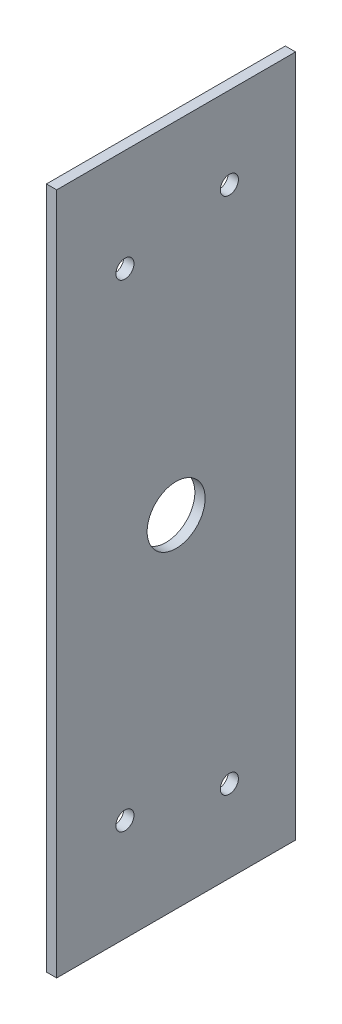
ISO-10303-21;
HEADER;
FILE_DESCRIPTION(('STEP AP214'),'2;1');
FILE_NAME('part.step','',(''),(''),'','','');
FILE_SCHEMA(('AUTOMOTIVE_DESIGN { 1 0 10303 214 1 1 1 1 }'));
ENDSEC;
DATA;
#1=APPLICATION_CONTEXT('core data for automotive mechanical design processes');
#2=APPLICATION_PROTOCOL_DEFINITION('international standard','automotive_design',2000,#1);
#3=PRODUCT_CONTEXT('',#1,'mechanical');
#4=PRODUCT('Part','Part','',(#3));
#5=PRODUCT_RELATED_PRODUCT_CATEGORY('part','',(#4));
#6=PRODUCT_DEFINITION_FORMATION('','',#4);
#7=PRODUCT_DEFINITION_CONTEXT('part definition',#1,'design');
#8=PRODUCT_DEFINITION('design','',#6,#7);
#9=PRODUCT_DEFINITION_SHAPE('','',#8);
#10=(LENGTH_UNIT() NAMED_UNIT(*) SI_UNIT(.MILLI.,.METRE.));
#11=(NAMED_UNIT(*) PLANE_ANGLE_UNIT() SI_UNIT($,.RADIAN.));
#12=(NAMED_UNIT(*) SI_UNIT($,.STERADIAN.) SOLID_ANGLE_UNIT());
#13=UNCERTAINTY_MEASURE_WITH_UNIT(LENGTH_MEASURE(1.E-05),#10,'distance_accuracy_value','');
#14=(GEOMETRIC_REPRESENTATION_CONTEXT(3) GLOBAL_UNCERTAINTY_ASSIGNED_CONTEXT((#13)) GLOBAL_UNIT_ASSIGNED_CONTEXT((#10,
#11,#12)) REPRESENTATION_CONTEXT('',''));
#15=CARTESIAN_POINT('',(0.,0.,0.));
#16=DIRECTION('',(0.,0.,1.));
#17=DIRECTION('',(1.,0.,0.));
#18=AXIS2_PLACEMENT_3D('',#15,#16,#17);
#19=CARTESIAN_POINT('',(3.,0.,0.));
#20=DIRECTION('',(1.,0.,0.));
#21=DIRECTION('',(0.,0.,-1.));
#22=AXIS2_PLACEMENT_3D('',#19,#20,#21);
#23=PLANE('',#22);
#24=CARTESIAN_POINT('',(3.,-70.,15.));
#25=DIRECTION('',(1.,0.,0.));
#26=DIRECTION('',(0.,0.,-1.));
#27=AXIS2_PLACEMENT_3D('',#24,#25,#26);
#28=CIRCLE('',#27,2.65);
#29=CARTESIAN_POINT('',(3.,-70.,12.35));
#30=VERTEX_POINT('',#29);
#31=EDGE_CURVE('E140',#30,#30,#28,.T.);
#32=ORIENTED_EDGE('',*,*,#31,.F.);
#33=EDGE_LOOP('',(#32));
#34=FACE_BOUND('',#33,.T.);
#35=CARTESIAN_POINT('',(3.,0.,0.));
#36=DIRECTION('',(1.,0.,0.));
#37=DIRECTION('',(0.,0.,-1.));
#38=AXIS2_PLACEMENT_3D('',#35,#36,#37);
#39=CIRCLE('',#38,8.5);
#40=CARTESIAN_POINT('',(3.,0.,-8.5));
#41=VERTEX_POINT('',#40);
#42=EDGE_CURVE('E121',#41,#41,#39,.T.);
#43=ORIENTED_EDGE('',*,*,#42,.F.);
#44=EDGE_LOOP('',(#43));
#45=FACE_BOUND('',#44,.T.);
#46=DIRECTION('',(0.,0.,-1.));
#47=VECTOR('',#46,1.);
#48=CARTESIAN_POINT('',(3.,-100.,35.));
#49=LINE('',#48,#47);
#50=CARTESIAN_POINT('',(3.,-100.,35.));
#51=VERTEX_POINT('',#50);
#52=CARTESIAN_POINT('',(3.,-100.,-35.));
#53=VERTEX_POINT('',#52);
#54=EDGE_CURVE('E92',#51,#53,#49,.T.);
#55=ORIENTED_EDGE('',*,*,#54,.T.);
#56=DIRECTION('',(0.,1.,0.));
#57=VECTOR('',#56,1.);
#58=CARTESIAN_POINT('',(3.,-100.,-35.));
#59=LINE('',#58,#57);
#60=CARTESIAN_POINT('',(3.,100.,-35.));
#61=VERTEX_POINT('',#60);
#62=EDGE_CURVE('E89',#53,#61,#59,.T.);
#63=ORIENTED_EDGE('',*,*,#62,.T.);
#64=DIRECTION('',(0.,0.,1.));
#65=VECTOR('',#64,1.);
#66=CARTESIAN_POINT('',(3.,100.,35.));
#67=LINE('',#66,#65);
#68=CARTESIAN_POINT('',(3.,100.,35.));
#69=VERTEX_POINT('',#68);
#70=EDGE_CURVE('E91',#61,#69,#67,.T.);
#71=ORIENTED_EDGE('',*,*,#70,.T.);
#72=DIRECTION('',(0.,-1.,0.));
#73=VECTOR('',#72,1.);
#74=CARTESIAN_POINT('',(3.,-100.,35.));
#75=LINE('',#74,#73);
#76=EDGE_CURVE('E58',#69,#51,#75,.T.);
#77=ORIENTED_EDGE('',*,*,#76,.T.);
#78=EDGE_LOOP('',(#55,#63,#71,#77));
#79=FACE_BOUND('',#78,.T.);
#80=CARTESIAN_POINT('',(3.,-76.,-15.6));
#81=DIRECTION('',(1.,0.,0.));
#82=DIRECTION('',(0.,0.,-1.));
#83=AXIS2_PLACEMENT_3D('',#80,#81,#82);
#84=CIRCLE('',#83,2.65);
#85=CARTESIAN_POINT('',(3.,-76.,-18.25));
#86=VERTEX_POINT('',#85);
#87=EDGE_CURVE('E109',#86,#86,#84,.T.);
#88=ORIENTED_EDGE('',*,*,#87,.F.);
#89=EDGE_LOOP('',(#88));
#90=FACE_BOUND('',#89,.T.);
#91=CARTESIAN_POINT('',(3.,76.,-15.5999999999999));
#92=DIRECTION('',(1.,0.,0.));
#93=DIRECTION('',(0.,0.,1.));
#94=AXIS2_PLACEMENT_3D('',#91,#92,#93);
#95=CIRCLE('',#94,2.65);
#96=CARTESIAN_POINT('',(3.,76.,-12.9499999999999));
#97=VERTEX_POINT('',#96);
#98=EDGE_CURVE('E132',#97,#97,#95,.T.);
#99=ORIENTED_EDGE('',*,*,#98,.F.);
#100=EDGE_LOOP('',(#99));
#101=FACE_BOUND('',#100,.T.);
#102=CARTESIAN_POINT('',(3.,70.,15.));
#103=DIRECTION('',(1.,0.,0.));
#104=DIRECTION('',(0.,0.,1.));
#105=AXIS2_PLACEMENT_3D('',#102,#103,#104);
#106=CIRCLE('',#105,2.65);
#107=CARTESIAN_POINT('',(3.,70.,17.65));
#108=VERTEX_POINT('',#107);
#109=EDGE_CURVE('E141',#108,#108,#106,.T.);
#110=ORIENTED_EDGE('',*,*,#109,.F.);
#111=EDGE_LOOP('',(#110));
#112=FACE_BOUND('',#111,.T.);
#113=ADVANCED_FACE('F43',(#34,#45,#79,#90,#101,#112),#23,.T.);
#114=CARTESIAN_POINT('',(0.,0.,0.));
#115=DIRECTION('',(1.,0.,0.));
#116=DIRECTION('',(0.,0.,-1.));
#117=AXIS2_PLACEMENT_3D('',#114,#115,#116);
#118=PLANE('',#117);
#119=DIRECTION('',(0.,0.,-1.));
#120=VECTOR('',#119,1.);
#121=CARTESIAN_POINT('',(0.,-100.,35.));
#122=LINE('',#121,#120);
#123=CARTESIAN_POINT('',(0.,-100.,35.));
#124=VERTEX_POINT('',#123);
#125=CARTESIAN_POINT('',(0.,-100.,-35.));
#126=VERTEX_POINT('',#125);
#127=EDGE_CURVE('E110',#124,#126,#122,.T.);
#128=ORIENTED_EDGE('',*,*,#127,.F.);
#129=DIRECTION('',(0.,-1.,0.));
#130=VECTOR('',#129,1.);
#131=CARTESIAN_POINT('',(0.,-100.,35.));
#132=LINE('',#131,#130);
#133=CARTESIAN_POINT('',(0.,100.,35.));
#134=VERTEX_POINT('',#133);
#135=EDGE_CURVE('E83',#134,#124,#132,.T.);
#136=ORIENTED_EDGE('',*,*,#135,.F.);
#137=DIRECTION('',(0.,0.,1.));
#138=VECTOR('',#137,1.);
#139=CARTESIAN_POINT('',(0.,100.,35.));
#140=LINE('',#139,#138);
#141=CARTESIAN_POINT('',(0.,100.,-35.));
#142=VERTEX_POINT('',#141);
#143=EDGE_CURVE('E80',#142,#134,#140,.T.);
#144=ORIENTED_EDGE('',*,*,#143,.F.);
#145=DIRECTION('',(0.,1.,0.));
#146=VECTOR('',#145,1.);
#147=CARTESIAN_POINT('',(0.,-100.,-35.));
#148=LINE('',#147,#146);
#149=EDGE_CURVE('E97',#126,#142,#148,.T.);
#150=ORIENTED_EDGE('',*,*,#149,.F.);
#151=EDGE_LOOP('',(#128,#136,#144,#150));
#152=FACE_BOUND('',#151,.T.);
#153=CARTESIAN_POINT('',(0.,-76.,-15.6));
#154=DIRECTION('',(1.,0.,0.));
#155=DIRECTION('',(0.,0.,-1.));
#156=AXIS2_PLACEMENT_3D('',#153,#154,#155);
#157=CIRCLE('',#156,2.65);
#158=CARTESIAN_POINT('',(0.,-76.,-18.25));
#159=VERTEX_POINT('',#158);
#160=EDGE_CURVE('E125',#159,#159,#157,.T.);
#161=ORIENTED_EDGE('',*,*,#160,.T.);
#162=EDGE_LOOP('',(#161));
#163=FACE_BOUND('',#162,.T.);
#164=CARTESIAN_POINT('',(0.,0.,0.));
#165=DIRECTION('',(1.,0.,0.));
#166=DIRECTION('',(0.,0.,-1.));
#167=AXIS2_PLACEMENT_3D('',#164,#165,#166);
#168=CIRCLE('',#167,8.5);
#169=CARTESIAN_POINT('',(0.,0.,-8.5));
#170=VERTEX_POINT('',#169);
#171=EDGE_CURVE('E126',#170,#170,#168,.T.);
#172=ORIENTED_EDGE('',*,*,#171,.T.);
#173=EDGE_LOOP('',(#172));
#174=FACE_BOUND('',#173,.T.);
#175=CARTESIAN_POINT('',(0.,76.,-15.5999999999999));
#176=DIRECTION('',(1.,0.,0.));
#177=DIRECTION('',(0.,0.,1.));
#178=AXIS2_PLACEMENT_3D('',#175,#176,#177);
#179=CIRCLE('',#178,2.65);
#180=CARTESIAN_POINT('',(0.,76.,-12.9499999999999));
#181=VERTEX_POINT('',#180);
#182=EDGE_CURVE('E131',#181,#181,#179,.T.);
#183=ORIENTED_EDGE('',*,*,#182,.T.);
#184=EDGE_LOOP('',(#183));
#185=FACE_BOUND('',#184,.T.);
#186=CARTESIAN_POINT('',(0.,-70.,15.));
#187=DIRECTION('',(1.,0.,0.));
#188=DIRECTION('',(0.,0.,-1.));
#189=AXIS2_PLACEMENT_3D('',#186,#187,#188);
#190=CIRCLE('',#189,2.65);
#191=CARTESIAN_POINT('',(0.,-70.,12.35));
#192=VERTEX_POINT('',#191);
#193=EDGE_CURVE('E136',#192,#192,#190,.T.);
#194=ORIENTED_EDGE('',*,*,#193,.T.);
#195=EDGE_LOOP('',(#194));
#196=FACE_BOUND('',#195,.T.);
#197=CARTESIAN_POINT('',(0.,70.,15.));
#198=DIRECTION('',(1.,0.,0.));
#199=DIRECTION('',(0.,0.,1.));
#200=AXIS2_PLACEMENT_3D('',#197,#198,#199);
#201=CIRCLE('',#200,2.65);
#202=CARTESIAN_POINT('',(0.,70.,17.65));
#203=VERTEX_POINT('',#202);
#204=EDGE_CURVE('E148',#203,#203,#201,.T.);
#205=ORIENTED_EDGE('',*,*,#204,.T.);
#206=EDGE_LOOP('',(#205));
#207=FACE_BOUND('',#206,.T.);
#208=ADVANCED_FACE('F119',(#152,#163,#174,#185,#196,#207),#118,.F.);
#209=CARTESIAN_POINT('',(3.,-100.,35.));
#210=DIRECTION('',(0.,1.,0.));
#211=DIRECTION('',(0.,0.,1.));
#212=AXIS2_PLACEMENT_3D('',#209,#210,#211);
#213=PLANE('',#212);
#214=ORIENTED_EDGE('',*,*,#127,.T.);
#215=DIRECTION('',(-1.,0.,0.));
#216=VECTOR('',#215,1.);
#217=CARTESIAN_POINT('',(3.,-100.,-35.));
#218=LINE('',#217,#216);
#219=EDGE_CURVE('E11',#53,#126,#218,.T.);
#220=ORIENTED_EDGE('',*,*,#219,.F.);
#221=ORIENTED_EDGE('',*,*,#54,.F.);
#222=DIRECTION('',(-1.,0.,0.));
#223=VECTOR('',#222,1.);
#224=CARTESIAN_POINT('',(3.,-100.,35.));
#225=LINE('',#224,#223);
#226=EDGE_CURVE('E103',#51,#124,#225,.T.);
#227=ORIENTED_EDGE('',*,*,#226,.T.);
#228=EDGE_LOOP('',(#214,#220,#221,#227));
#229=FACE_BOUND('',#228,.T.);
#230=ADVANCED_FACE('F44',(#229),#213,.F.);
#231=CARTESIAN_POINT('',(3.,-100.,-35.));
#232=DIRECTION('',(0.,0.,1.));
#233=DIRECTION('',(1.,0.,0.));
#234=AXIS2_PLACEMENT_3D('',#231,#232,#233);
#235=PLANE('',#234);
#236=ORIENTED_EDGE('',*,*,#149,.T.);
#237=DIRECTION('',(-1.,0.,0.));
#238=VECTOR('',#237,1.);
#239=CARTESIAN_POINT('',(3.,100.,-35.));
#240=LINE('',#239,#238);
#241=EDGE_CURVE('E55',#61,#142,#240,.T.);
#242=ORIENTED_EDGE('',*,*,#241,.F.);
#243=ORIENTED_EDGE('',*,*,#62,.F.);
#244=ORIENTED_EDGE('',*,*,#219,.T.);
#245=EDGE_LOOP('',(#236,#242,#243,#244));
#246=FACE_BOUND('',#245,.T.);
#247=ADVANCED_FACE('F98',(#246),#235,.F.);
#248=CARTESIAN_POINT('',(3.,100.,35.));
#249=DIRECTION('',(0.,-1.,0.));
#250=DIRECTION('',(0.,0.,-1.));
#251=AXIS2_PLACEMENT_3D('',#248,#249,#250);
#252=PLANE('',#251);
#253=ORIENTED_EDGE('',*,*,#143,.T.);
#254=DIRECTION('',(-1.,0.,0.));
#255=VECTOR('',#254,1.);
#256=CARTESIAN_POINT('',(3.,100.,35.));
#257=LINE('',#256,#255);
#258=EDGE_CURVE('E99',#69,#134,#257,.T.);
#259=ORIENTED_EDGE('',*,*,#258,.F.);
#260=ORIENTED_EDGE('',*,*,#70,.F.);
#261=ORIENTED_EDGE('',*,*,#241,.T.);
#262=EDGE_LOOP('',(#253,#259,#260,#261));
#263=FACE_BOUND('',#262,.T.);
#264=ADVANCED_FACE('F101',(#263),#252,.F.);
#265=CARTESIAN_POINT('',(3.,-100.,35.));
#266=DIRECTION('',(0.,0.,-1.));
#267=DIRECTION('',(-1.,0.,0.));
#268=AXIS2_PLACEMENT_3D('',#265,#266,#267);
#269=PLANE('',#268);
#270=ORIENTED_EDGE('',*,*,#135,.T.);
#271=ORIENTED_EDGE('',*,*,#226,.F.);
#272=ORIENTED_EDGE('',*,*,#76,.F.);
#273=ORIENTED_EDGE('',*,*,#258,.T.);
#274=EDGE_LOOP('',(#270,#271,#272,#273));
#275=FACE_BOUND('',#274,.T.);
#276=ADVANCED_FACE('F113',(#275),#269,.F.);
#277=CARTESIAN_POINT('',(3.,-76.,-15.6));
#278=DIRECTION('',(-1.,0.,0.));
#279=DIRECTION('',(0.,0.,1.));
#280=AXIS2_PLACEMENT_3D('',#277,#278,#279);
#281=CYLINDRICAL_SURFACE('',#280,2.65);
#282=ORIENTED_EDGE('',*,*,#87,.T.);
#283=EDGE_LOOP('',(#282));
#284=FACE_BOUND('',#283,.T.);
#285=ORIENTED_EDGE('',*,*,#160,.F.);
#286=EDGE_LOOP('',(#285));
#287=FACE_BOUND('',#286,.T.);
#288=ADVANCED_FACE('F164',(#284,#287),#281,.F.);
#289=CARTESIAN_POINT('',(3.,0.,0.));
#290=DIRECTION('',(-1.,0.,0.));
#291=DIRECTION('',(0.,0.,1.));
#292=AXIS2_PLACEMENT_3D('',#289,#290,#291);
#293=CYLINDRICAL_SURFACE('',#292,8.5);
#294=ORIENTED_EDGE('',*,*,#42,.T.);
#295=EDGE_LOOP('',(#294));
#296=FACE_BOUND('',#295,.T.);
#297=ORIENTED_EDGE('',*,*,#171,.F.);
#298=EDGE_LOOP('',(#297));
#299=FACE_BOUND('',#298,.T.);
#300=ADVANCED_FACE('F209',(#296,#299),#293,.F.);
#301=CARTESIAN_POINT('',(3.,76.,-15.5999999999999));
#302=DIRECTION('',(-1.,0.,0.));
#303=DIRECTION('',(0.,0.,1.));
#304=AXIS2_PLACEMENT_3D('',#301,#302,#303);
#305=CYLINDRICAL_SURFACE('',#304,2.65);
#306=ORIENTED_EDGE('',*,*,#98,.T.);
#307=EDGE_LOOP('',(#306));
#308=FACE_BOUND('',#307,.T.);
#309=ORIENTED_EDGE('',*,*,#182,.F.);
#310=EDGE_LOOP('',(#309));
#311=FACE_BOUND('',#310,.T.);
#312=ADVANCED_FACE('F217',(#308,#311),#305,.F.);
#313=CARTESIAN_POINT('',(3.,-70.,15.));
#314=DIRECTION('',(-1.,0.,0.));
#315=DIRECTION('',(0.,0.,1.));
#316=AXIS2_PLACEMENT_3D('',#313,#314,#315);
#317=CYLINDRICAL_SURFACE('',#316,2.65);
#318=ORIENTED_EDGE('',*,*,#31,.T.);
#319=EDGE_LOOP('',(#318));
#320=FACE_BOUND('',#319,.T.);
#321=ORIENTED_EDGE('',*,*,#193,.F.);
#322=EDGE_LOOP('',(#321));
#323=FACE_BOUND('',#322,.T.);
#324=ADVANCED_FACE('F227',(#320,#323),#317,.F.);
#325=CARTESIAN_POINT('',(3.,70.,15.));
#326=DIRECTION('',(-1.,0.,0.));
#327=DIRECTION('',(0.,0.,1.));
#328=AXIS2_PLACEMENT_3D('',#325,#326,#327);
#329=CYLINDRICAL_SURFACE('',#328,2.65);
#330=ORIENTED_EDGE('',*,*,#109,.T.);
#331=EDGE_LOOP('',(#330));
#332=FACE_BOUND('',#331,.T.);
#333=ORIENTED_EDGE('',*,*,#204,.F.);
#334=EDGE_LOOP('',(#333));
#335=FACE_BOUND('',#334,.T.);
#336=ADVANCED_FACE('F155',(#332,#335),#329,.F.);
#337=CLOSED_SHELL('',(#113,#208,#230,#247,#264,#276,#288,#300,#312,#324,#336));
#338=MANIFOLD_SOLID_BREP('B2',#337);
#339=ADVANCED_BREP_SHAPE_REPRESENTATION('',(#18,#338),#14);
#340=SHAPE_DEFINITION_REPRESENTATION(#9,#339);
ENDSEC;
END-ISO-10303-21;
